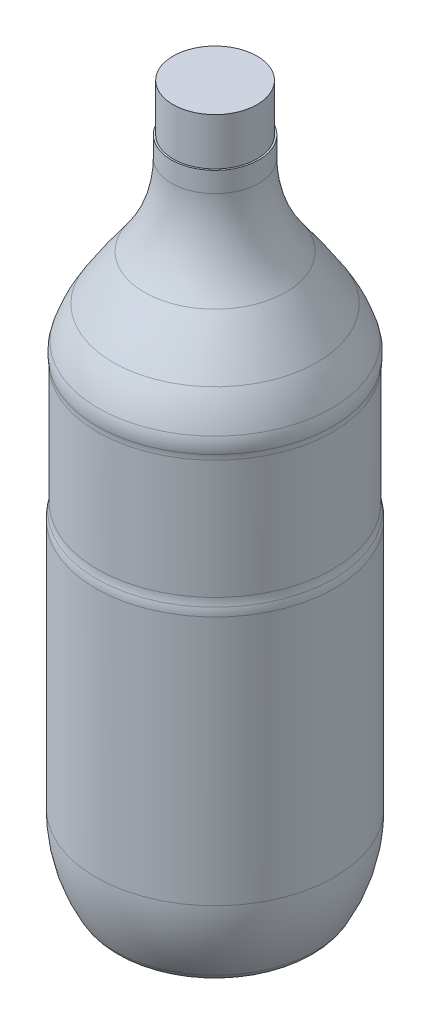
ISO-10303-21;
HEADER;
FILE_DESCRIPTION(('STEP AP214'),'2;1');
FILE_NAME('part.step','',(''),(''),'','','');
FILE_SCHEMA(('AUTOMOTIVE_DESIGN { 1 0 10303 214 1 1 1 1 }'));
ENDSEC;
DATA;
#1=APPLICATION_CONTEXT('core data for automotive mechanical design processes');
#2=APPLICATION_PROTOCOL_DEFINITION('international standard','automotive_design',2000,#1);
#3=PRODUCT_CONTEXT('',#1,'mechanical');
#4=PRODUCT('Part','Part','',(#3));
#5=PRODUCT_RELATED_PRODUCT_CATEGORY('part','',(#4));
#6=PRODUCT_DEFINITION_FORMATION('','',#4);
#7=PRODUCT_DEFINITION_CONTEXT('part definition',#1,'design');
#8=PRODUCT_DEFINITION('design','',#6,#7);
#9=PRODUCT_DEFINITION_SHAPE('','',#8);
#10=(LENGTH_UNIT() NAMED_UNIT(*) SI_UNIT(.MILLI.,.METRE.));
#11=(NAMED_UNIT(*) PLANE_ANGLE_UNIT() SI_UNIT($,.RADIAN.));
#12=(NAMED_UNIT(*) SI_UNIT($,.STERADIAN.) SOLID_ANGLE_UNIT());
#13=UNCERTAINTY_MEASURE_WITH_UNIT(LENGTH_MEASURE(1.E-05),#10,'distance_accuracy_value','');
#14=(GEOMETRIC_REPRESENTATION_CONTEXT(3) GLOBAL_UNCERTAINTY_ASSIGNED_CONTEXT((#13)) GLOBAL_UNIT_ASSIGNED_CONTEXT((#10,
#11,#12)) REPRESENTATION_CONTEXT('',''));
#15=CARTESIAN_POINT('',(0.,0.,0.));
#16=DIRECTION('',(0.,0.,1.));
#17=DIRECTION('',(1.,0.,0.));
#18=AXIS2_PLACEMENT_3D('',#15,#16,#17);
#19=CARTESIAN_POINT('',(-40.2053538173723,-125.065481615697,0.));
#20=DIRECTION('',(0.,-1.,0.));
#21=DIRECTION('',(1.,0.,0.));
#22=AXIS2_PLACEMENT_3D('',#19,#20,#21);
#23=TOROIDAL_SURFACE('',#22,24.5587727318528,5.99999999999999);
#24=CARTESIAN_POINT('',(-40.2053538173723,-129.552252448802,0.));
#25=DIRECTION('',(0.,-1.,0.));
#26=DIRECTION('',(1.,0.,0.));
#27=AXIS2_PLACEMENT_3D('',#24,#25,#26);
#28=CIRCLE('',#27,20.5751955089039);
#29=CARTESIAN_POINT('',(-19.6301583084684,-129.552252448802,0.));
#30=VERTEX_POINT('',#29);
#31=EDGE_CURVE('E56',#30,#30,#28,.T.);
#32=ORIENTED_EDGE('',*,*,#31,.F.);
#33=EDGE_LOOP('',(#32));
#34=FACE_BOUND('',#33,.T.);
#35=CARTESIAN_POINT('',(-40.2053538173723,-127.988558538774,0.));
#36=DIRECTION('',(0.,-1.,0.));
#37=DIRECTION('',(1.,0.,0.));
#38=AXIS2_PLACEMENT_3D('',#35,#36,#37);
#39=CIRCLE('',#38,29.7985839213686);
#40=CARTESIAN_POINT('',(-10.4067698960037,-127.988558538774,0.));
#41=VERTEX_POINT('',#40);
#42=EDGE_CURVE('E121',#41,#41,#39,.T.);
#43=ORIENTED_EDGE('',*,*,#42,.T.);
#44=EDGE_LOOP('',(#43));
#45=FACE_BOUND('',#44,.T.);
#46=ADVANCED_FACE('F39',(#34,#45),#23,.T.);
#47=CARTESIAN_POINT('',(-36.228396737422,-148.247130920074,0.));
#48=DIRECTION('',(0.,0.,-1.));
#49=DIRECTION('',(1.,0.,0.));
#50=AXIS2_PLACEMENT_3D('',#47,#48,#49);
#51=CIRCLE('',#50,25.);
#52=TRIMMED_CURVE('',#51,(PARAMETER_VALUE(-1.73055330401994)),
(PARAMETER_VALUE(1.73055330401994)),.T.,.PARAMETER.);
#53=CARTESIAN_POINT('',(-40.2053538173723,-148.247130920074,0.));
#54=DIRECTION('',(0.,-1.,0.));
#55=AXIS1_PLACEMENT('',#53,#54);
#56=SURFACE_OF_REVOLUTION('',#52,#55);
#57=CARTESIAN_POINT('',(-40.2053538173723,-123.565481615697,0.));
#58=VERTEX_POINT('',#57);
#59=VERTEX_LOOP('',#58);
#60=FACE_BOUND('',#59,.T.);
#61=ORIENTED_EDGE('',*,*,#31,.T.);
#62=EDGE_LOOP('',(#61));
#63=FACE_BOUND('',#62,.T.);
#64=ADVANCED_FACE('F49',(#60,#63),#56,.F.);
#65=CARTESIAN_POINT('',(0.,81.4345183843031,0.));
#66=DIRECTION('',(0.,1.,0.));
#67=DIRECTION('',(-1.,0.,0.));
#68=AXIS2_PLACEMENT_3D('',#65,#66,#67);
#69=PLANE('',#68);
#70=CARTESIAN_POINT('',(-40.2053538173723,81.4345183843031,0.));
#71=DIRECTION('',(0.,-1.,0.));
#72=DIRECTION('',(1.,0.,0.));
#73=AXIS2_PLACEMENT_3D('',#70,#71,#72);
#74=CIRCLE('',#73,12.5);
#75=CARTESIAN_POINT('',(-27.7053538173723,81.4345183843031,0.));
#76=VERTEX_POINT('',#75);
#77=EDGE_CURVE('E59',#76,#76,#74,.T.);
#78=ORIENTED_EDGE('',*,*,#77,.F.);
#79=EDGE_LOOP('',(#78));
#80=FACE_BOUND('',#79,.T.);
#81=ADVANCED_FACE('F52',(#80),#69,.T.);
#82=CARTESIAN_POINT('',(-40.2053538173723,-122.895686872596,0.));
#83=DIRECTION('',(0.,-1.,0.));
#84=DIRECTION('',(1.,0.,0.));
#85=AXIS2_PLACEMENT_3D('',#82,#83,#84);
#86=CYLINDRICAL_SURFACE('',#85,12.5);
#87=CARTESIAN_POINT('',(-40.2053538173723,67.4345183843031,0.));
#88=DIRECTION('',(0.,-1.,0.));
#89=DIRECTION('',(1.,0.,0.));
#90=AXIS2_PLACEMENT_3D('',#87,#88,#89);
#91=CIRCLE('',#90,12.5);
#92=CARTESIAN_POINT('',(-27.7053538173723,67.4345183843031,0.));
#93=VERTEX_POINT('',#92);
#94=EDGE_CURVE('E65',#93,#93,#91,.T.);
#95=ORIENTED_EDGE('',*,*,#94,.F.);
#96=EDGE_LOOP('',(#95));
#97=FACE_BOUND('',#96,.T.);
#98=ORIENTED_EDGE('',*,*,#77,.T.);
#99=EDGE_LOOP('',(#98));
#100=FACE_BOUND('',#99,.T.);
#101=ADVANCED_FACE('F141',(#97,#100),#86,.T.);
#102=CARTESIAN_POINT('',(3.74336774823756E-12,67.4345183843031,0.));
#103=DIRECTION('',(0.,-1.,0.));
#104=DIRECTION('',(1.,0.,0.));
#105=AXIS2_PLACEMENT_3D('',#102,#103,#104);
#106=PLANE('',#105);
#107=CARTESIAN_POINT('',(-40.2053538173723,67.4345183843031,0.));
#108=DIRECTION('',(0.,-1.,0.));
#109=DIRECTION('',(1.,0.,0.));
#110=AXIS2_PLACEMENT_3D('',#107,#108,#109);
#111=CIRCLE('',#110,13.);
#112=CARTESIAN_POINT('',(-27.2053538173723,67.4345183843031,0.));
#113=VERTEX_POINT('',#112);
#114=EDGE_CURVE('E134',#113,#113,#111,.T.);
#115=ORIENTED_EDGE('',*,*,#114,.F.);
#116=EDGE_LOOP('',(#115));
#117=FACE_BOUND('',#116,.T.);
#118=ORIENTED_EDGE('',*,*,#94,.T.);
#119=EDGE_LOOP('',(#118));
#120=FACE_BOUND('',#119,.T.);
#121=ADVANCED_FACE('F139',(#117,#120),#106,.F.);
#122=CARTESIAN_POINT('',(-40.2053538173723,-122.895686872596,0.));
#123=DIRECTION('',(0.,-1.,0.));
#124=DIRECTION('',(1.,0.,0.));
#125=AXIS2_PLACEMENT_3D('',#122,#123,#124);
#126=CYLINDRICAL_SURFACE('',#125,13.);
#127=CARTESIAN_POINT('',(-40.2053538173723,61.4345183843031,0.));
#128=DIRECTION('',(0.,-1.,0.));
#129=DIRECTION('',(1.,0.,0.));
#130=AXIS2_PLACEMENT_3D('',#127,#128,#129);
#131=CIRCLE('',#130,13.);
#132=CARTESIAN_POINT('',(-27.2053538173723,61.4345183843031,0.));
#133=VERTEX_POINT('',#132);
#134=EDGE_CURVE('E131',#133,#133,#131,.T.);
#135=ORIENTED_EDGE('',*,*,#134,.F.);
#136=EDGE_LOOP('',(#135));
#137=FACE_BOUND('',#136,.T.);
#138=ORIENTED_EDGE('',*,*,#114,.T.);
#139=EDGE_LOOP('',(#138));
#140=FACE_BOUND('',#139,.T.);
#141=ADVANCED_FACE('F153',(#137,#140),#126,.T.);
#142=CARTESIAN_POINT('',(-40.2053538173723,61.4345183843031,0.));
#143=DIRECTION('',(0.,-1.,0.));
#144=DIRECTION('',(1.,0.,0.));
#145=AXIS2_PLACEMENT_3D('',#142,#143,#144);
#146=TOROIDAL_SURFACE('',#145,53.,40.);
#147=CARTESIAN_POINT('',(-40.2053538173723,37.3682374003215,0.));
#148=DIRECTION('',(0.,-1.,0.));
#149=DIRECTION('',(1.,0.,0.));
#150=AXIS2_PLACEMENT_3D('',#147,#148,#149);
#151=CIRCLE('',#150,21.0498181601412);
#152=CARTESIAN_POINT('',(-19.1555356572312,37.3682374003215,0.));
#153=VERTEX_POINT('',#152);
#154=EDGE_CURVE('E124',#153,#153,#151,.T.);
#155=ORIENTED_EDGE('',*,*,#154,.F.);
#156=EDGE_LOOP('',(#155));
#157=FACE_BOUND('',#156,.T.);
#158=ORIENTED_EDGE('',*,*,#134,.T.);
#159=EDGE_LOOP('',(#158));
#160=FACE_BOUND('',#159,.T.);
#161=ADVANCED_FACE('F157',(#157,#160),#146,.F.);
#162=CARTESIAN_POINT('',(-40.2053538173723,-82.9631675195865,0.));
#163=DIRECTION('',(0.,-1.,0.));
#164=DIRECTION('',(1.,0.,0.));
#165=AXIS2_PLACEMENT_3D('',#162,#163,#164);
#166=DEGENERATE_TOROIDAL_SURFACE('',#165,138.701091039153,200.,.F.);
#167=CARTESIAN_POINT('',(-40.2053538173723,23.9345183843031,0.));
#168=DIRECTION('',(0.,-1.,0.));
#169=DIRECTION('',(1.,0.,0.));
#170=AXIS2_PLACEMENT_3D('',#167,#168,#169);
#171=CIRCLE('',#170,30.3340672812193);
#172=CARTESIAN_POINT('',(-9.87128653615298,23.9345183843031,0.));
#173=VERTEX_POINT('',#172);
#174=EDGE_CURVE('E120',#173,#173,#171,.T.);
#175=ORIENTED_EDGE('',*,*,#174,.F.);
#176=EDGE_LOOP('',(#175));
#177=FACE_BOUND('',#176,.T.);
#178=ORIENTED_EDGE('',*,*,#154,.T.);
#179=EDGE_LOOP('',(#178));
#180=FACE_BOUND('',#179,.T.);
#181=ADVANCED_FACE('F161',(#177,#180),#166,.F.);
#182=CARTESIAN_POINT('',(-40.2053538173723,2.55498120352517,0.));
#183=DIRECTION('',(0.,-1.,0.));
#184=DIRECTION('',(1.,0.,0.));
#185=AXIS2_PLACEMENT_3D('',#182,#183,#184);
#186=DEGENERATE_TOROIDAL_SURFACE('',#185,3.47296438285517,40.,.F.);
#187=CARTESIAN_POINT('',(-40.2053538173723,14.3490615552958,0.));
#188=DIRECTION('',(0.,-1.,0.));
#189=DIRECTION('',(1.,0.,0.));
#190=AXIS2_PLACEMENT_3D('',#187,#188,#189);
#191=CIRCLE('',#190,34.7487528555942);
#192=CARTESIAN_POINT('',(-5.45660096177811,14.3490615552958,0.));
#193=VERTEX_POINT('',#192);
#194=EDGE_CURVE('E11',#193,#193,#191,.F.);
#195=ORIENTED_EDGE('',*,*,#194,.T.);
#196=EDGE_LOOP('',(#195));
#197=FACE_BOUND('',#196,.T.);
#198=ORIENTED_EDGE('',*,*,#174,.T.);
#199=EDGE_LOOP('',(#198));
#200=FACE_BOUND('',#199,.T.);
#201=ADVANCED_FACE('F165',(#197,#200),#186,.F.);
#202=CARTESIAN_POINT('',(-40.2053538173723,-122.895686872596,0.));
#203=DIRECTION('',(0.,-1.,0.));
#204=DIRECTION('',(1.,0.,0.));
#205=AXIS2_PLACEMENT_3D('',#202,#203,#204);
#206=CYLINDRICAL_SURFACE('',#205,34.95);
#207=CARTESIAN_POINT('',(-40.2053538173723,8.29027853775277,0.));
#208=DIRECTION('',(0.,1.,0.));
#209=DIRECTION('',(-1.,0.,0.));
#210=AXIS2_PLACEMENT_3D('',#207,#208,#209);
#211=CIRCLE('',#210,34.95);
#212=CARTESIAN_POINT('',(-75.1553538173723,8.29027853775277,0.));
#213=VERTEX_POINT('',#212);
#214=EDGE_CURVE('E74',#213,#213,#211,.F.);
#215=ORIENTED_EDGE('',*,*,#214,.T.);
#216=EDGE_LOOP('',(#215));
#217=FACE_BOUND('',#216,.T.);
#218=CARTESIAN_POINT('',(-40.2053538173723,-27.0516639271796,0.));
#219=DIRECTION('',(0.,-1.,0.));
#220=DIRECTION('',(1.,0.,0.));
#221=AXIS2_PLACEMENT_3D('',#218,#219,#220);
#222=CIRCLE('',#221,34.95);
#223=CARTESIAN_POINT('',(-5.25535381737231,-27.0516639271796,0.));
#224=VERTEX_POINT('',#223);
#225=EDGE_CURVE('E71',#224,#224,#222,.F.);
#226=ORIENTED_EDGE('',*,*,#225,.T.);
#227=EDGE_LOOP('',(#226));
#228=FACE_BOUND('',#227,.T.);
#229=ADVANCED_FACE('F114',(#217,#228),#206,.T.);
#230=CARTESIAN_POINT('',(-40.2053538173723,-122.895686872596,0.));
#231=DIRECTION('',(0.,-1.,0.));
#232=DIRECTION('',(1.,0.,0.));
#233=AXIS2_PLACEMENT_3D('',#230,#231,#232);
#234=CYLINDRICAL_SURFACE('',#233,35.5);
#235=CARTESIAN_POINT('',(-40.2053538173723,-31.7097214622472,0.));
#236=DIRECTION('',(0.,1.,0.));
#237=DIRECTION('',(-1.,0.,0.));
#238=AXIS2_PLACEMENT_3D('',#235,#236,#237);
#239=CIRCLE('',#238,35.5);
#240=CARTESIAN_POINT('',(-75.7053538173723,-31.7097214622472,0.));
#241=VERTEX_POINT('',#240);
#242=EDGE_CURVE('E58',#241,#241,#239,.F.);
#243=ORIENTED_EDGE('',*,*,#242,.T.);
#244=EDGE_LOOP('',(#243));
#245=FACE_BOUND('',#244,.T.);
#246=CARTESIAN_POINT('',(-40.2053538173723,-106.065481615697,0.));
#247=DIRECTION('',(0.,-1.,0.));
#248=DIRECTION('',(1.,0.,0.));
#249=AXIS2_PLACEMENT_3D('',#246,#247,#248);
#250=CIRCLE('',#249,35.5);
#251=CARTESIAN_POINT('',(-4.7053538173723,-106.065481615697,0.));
#252=VERTEX_POINT('',#251);
#253=EDGE_CURVE('E118',#252,#252,#250,.T.);
#254=ORIENTED_EDGE('',*,*,#253,.F.);
#255=EDGE_LOOP('',(#254));
#256=FACE_BOUND('',#255,.T.);
#257=ADVANCED_FACE('F111',(#245,#256),#234,.T.);
#258=CARTESIAN_POINT('',(-40.2053538173723,-106.065481615697,0.));
#259=DIRECTION('',(0.,-1.,0.));
#260=DIRECTION('',(1.,0.,0.));
#261=AXIS2_PLACEMENT_3D('',#258,#259,#260);
#262=DEGENERATE_TOROIDAL_SURFACE('',#261,9.5,45.,.F.);
#263=ORIENTED_EDGE('',*,*,#42,.F.);
#264=EDGE_LOOP('',(#263));
#265=FACE_BOUND('',#264,.T.);
#266=ORIENTED_EDGE('',*,*,#253,.T.);
#267=EDGE_LOOP('',(#266));
#268=FACE_BOUND('',#267,.T.);
#269=ADVANCED_FACE('F99',(#265,#268),#262,.F.);
#270=CARTESIAN_POINT('',(-40.2053538173723,-31.7097214622472,0.));
#271=DIRECTION('',(0.,1.,0.));
#272=DIRECTION('',(-1.,0.,0.));
#273=AXIS2_PLACEMENT_3D('',#270,#271,#272);
#274=TOROIDAL_SURFACE('',#273,25.5,10.);
#275=CARTESIAN_POINT('',(-40.2053538173723,-29.3806926947134,0.));
#276=DIRECTION('',(0.,-1.,0.));
#277=DIRECTION('',(1.,0.,0.));
#278=AXIS2_PLACEMENT_3D('',#275,#276,#277);
#279=CIRCLE('',#278,35.225);
#280=CARTESIAN_POINT('',(-4.98035381737233,-29.3806926947134,0.));
#281=VERTEX_POINT('',#280);
#282=EDGE_CURVE('E62',#281,#281,#279,.T.);
#283=ORIENTED_EDGE('',*,*,#282,.T.);
#284=EDGE_LOOP('',(#283));
#285=FACE_BOUND('',#284,.T.);
#286=ORIENTED_EDGE('',*,*,#242,.F.);
#287=EDGE_LOOP('',(#286));
#288=FACE_BOUND('',#287,.T.);
#289=ADVANCED_FACE('F96',(#285,#288),#274,.T.);
#290=CARTESIAN_POINT('',(-40.2053538173723,-27.0516639271796,0.));
#291=DIRECTION('',(0.,-1.,0.));
#292=DIRECTION('',(1.,0.,0.));
#293=AXIS2_PLACEMENT_3D('',#290,#291,#292);
#294=TOROIDAL_SURFACE('',#293,44.95,10.);
#295=ORIENTED_EDGE('',*,*,#225,.F.);
#296=EDGE_LOOP('',(#295));
#297=FACE_BOUND('',#296,.T.);
#298=ORIENTED_EDGE('',*,*,#282,.F.);
#299=EDGE_LOOP('',(#298));
#300=FACE_BOUND('',#299,.T.);
#301=ADVANCED_FACE('F87',(#297,#300),#294,.F.);
#302=CARTESIAN_POINT('',(-40.2053538173723,8.29027853775277,0.));
#303=DIRECTION('',(0.,1.,0.));
#304=DIRECTION('',(-1.,0.,0.));
#305=AXIS2_PLACEMENT_3D('',#302,#303,#304);
#306=TOROIDAL_SURFACE('',#305,44.95,10.);
#307=CARTESIAN_POINT('',(-40.2053538173723,9.84541000255295,0.));
#308=DIRECTION('',(0.,-1.,0.));
#309=DIRECTION('',(1.,0.,0.));
#310=AXIS2_PLACEMENT_3D('',#307,#308,#309);
#311=CIRCLE('',#310,35.0716617729909);
#312=CARTESIAN_POINT('',(-5.13369204438138,9.84541000255296,0.));
#313=VERTEX_POINT('',#312);
#314=EDGE_CURVE('E46',#313,#313,#311,.T.);
#315=ORIENTED_EDGE('',*,*,#314,.T.);
#316=EDGE_LOOP('',(#315));
#317=FACE_BOUND('',#316,.T.);
#318=ORIENTED_EDGE('',*,*,#214,.F.);
#319=EDGE_LOOP('',(#318));
#320=FACE_BOUND('',#319,.T.);
#321=ADVANCED_FACE('F79',(#317,#320),#306,.F.);
#322=CARTESIAN_POINT('',(-40.2053538173723,11.4005414673531,0.));
#323=DIRECTION('',(0.,1.,0.));
#324=DIRECTION('',(-1.,0.,0.));
#325=AXIS2_PLACEMENT_3D('',#322,#323,#324);
#326=TOROIDAL_SURFACE('',#325,25.1933235459819,10.);
#327=ORIENTED_EDGE('',*,*,#194,.F.);
#328=EDGE_LOOP('',(#327));
#329=FACE_BOUND('',#328,.T.);
#330=ORIENTED_EDGE('',*,*,#314,.F.);
#331=EDGE_LOOP('',(#330));
#332=FACE_BOUND('',#331,.T.);
#333=ADVANCED_FACE('F41',(#329,#332),#326,.T.);
#334=CLOSED_SHELL('',(#46,#64,#81,#101,#121,#141,#161,#181,#201,#229,#257,#269,#289,#301,#321,#333));
#335=MANIFOLD_SOLID_BREP('B2',#334);
#336=ADVANCED_BREP_SHAPE_REPRESENTATION('',(#18,#335),#14);
#337=SHAPE_DEFINITION_REPRESENTATION(#9,#336);
ENDSEC;
END-ISO-10303-21;
